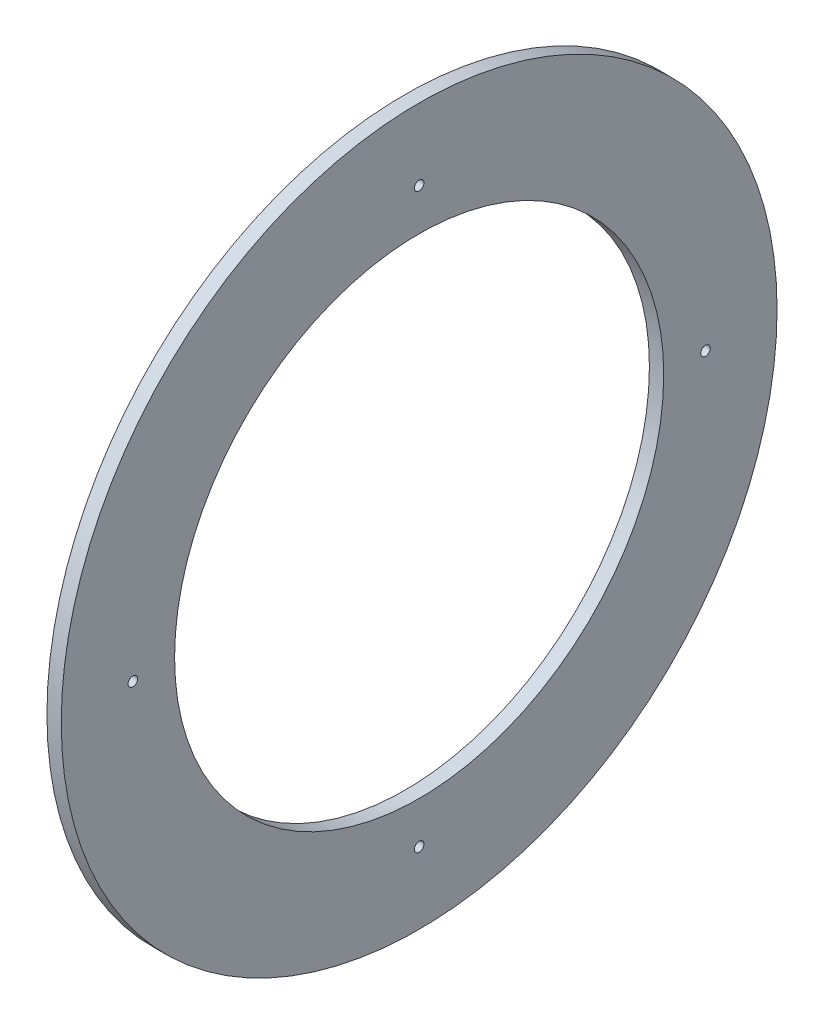
ISO-10303-21;
HEADER;
FILE_DESCRIPTION(('STEP AP214'),'2;1');
FILE_NAME('part.step','',(''),(''),'','','');
FILE_SCHEMA(('AUTOMOTIVE_DESIGN { 1 0 10303 214 1 1 1 1 }'));
ENDSEC;
DATA;
#1=APPLICATION_CONTEXT('core data for automotive mechanical design processes');
#2=APPLICATION_PROTOCOL_DEFINITION('international standard','automotive_design',2000,#1);
#3=PRODUCT_CONTEXT('',#1,'mechanical');
#4=PRODUCT('Part','Part','',(#3));
#5=PRODUCT_RELATED_PRODUCT_CATEGORY('part','',(#4));
#6=PRODUCT_DEFINITION_FORMATION('','',#4);
#7=PRODUCT_DEFINITION_CONTEXT('part definition',#1,'design');
#8=PRODUCT_DEFINITION('design','',#6,#7);
#9=PRODUCT_DEFINITION_SHAPE('','',#8);
#10=(LENGTH_UNIT() NAMED_UNIT(*) SI_UNIT(.MILLI.,.METRE.));
#11=(NAMED_UNIT(*) PLANE_ANGLE_UNIT() SI_UNIT($,.RADIAN.));
#12=(NAMED_UNIT(*) SI_UNIT($,.STERADIAN.) SOLID_ANGLE_UNIT());
#13=UNCERTAINTY_MEASURE_WITH_UNIT(LENGTH_MEASURE(1.E-05),#10,'distance_accuracy_value','');
#14=(GEOMETRIC_REPRESENTATION_CONTEXT(3) GLOBAL_UNCERTAINTY_ASSIGNED_CONTEXT((#13)) GLOBAL_UNIT_ASSIGNED_CONTEXT((#10,
#11,#12)) REPRESENTATION_CONTEXT('',''));
#15=CARTESIAN_POINT('',(0.,0.,0.));
#16=DIRECTION('',(0.,0.,1.));
#17=DIRECTION('',(1.,0.,0.));
#18=AXIS2_PLACEMENT_3D('',#15,#16,#17);
#19=CARTESIAN_POINT('',(3.,0.,0.));
#20=DIRECTION('',(1.,0.,0.));
#21=DIRECTION('',(0.,0.,-1.));
#22=AXIS2_PLACEMENT_3D('',#19,#20,#21);
#23=PLANE('',#22);
#24=CARTESIAN_POINT('',(3.,1.69795468502936E-12,-60.0000000000019));
#25=DIRECTION('',(1.,0.,0.));
#26=DIRECTION('',(0.,0.,-1.));
#27=AXIS2_PLACEMENT_3D('',#24,#25,#26);
#28=CIRCLE('',#27,0.999999999999998);
#29=CARTESIAN_POINT('',(3.,1.69795468502936E-12,-61.0000000000019));
#30=VERTEX_POINT('',#29);
#31=EDGE_CURVE('E68',#30,#30,#28,.T.);
#32=ORIENTED_EDGE('',*,*,#31,.F.);
#33=EDGE_LOOP('',(#32));
#34=FACE_BOUND('',#33,.T.);
#35=CARTESIAN_POINT('',(3.,-60.,-3.59206192068241E-12));
#36=DIRECTION('',(1.,0.,0.));
#37=DIRECTION('',(0.,0.,-1.));
#38=AXIS2_PLACEMENT_3D('',#35,#36,#37);
#39=CIRCLE('',#38,1.);
#40=CARTESIAN_POINT('',(3.,-60.,-1.00000000000359));
#41=VERTEX_POINT('',#40);
#42=EDGE_CURVE('E62',#41,#41,#39,.T.);
#43=ORIENTED_EDGE('',*,*,#42,.F.);
#44=EDGE_LOOP('',(#43));
#45=FACE_BOUND('',#44,.T.);
#46=CARTESIAN_POINT('',(3.,-1.70530256582424E-12,59.9999999999981));
#47=DIRECTION('',(1.,0.,0.));
#48=DIRECTION('',(0.,0.,-1.));
#49=AXIS2_PLACEMENT_3D('',#46,#47,#48);
#50=CIRCLE('',#49,0.999999999999998);
#51=CARTESIAN_POINT('',(3.,-1.70530256582424E-12,58.9999999999981));
#52=VERTEX_POINT('',#51);
#53=EDGE_CURVE('E56',#52,#52,#50,.T.);
#54=ORIENTED_EDGE('',*,*,#53,.F.);
#55=EDGE_LOOP('',(#54));
#56=FACE_BOUND('',#55,.T.);
#57=CARTESIAN_POINT('',(3.,60.,-1.96152550623697E-13));
#58=DIRECTION('',(1.,0.,0.));
#59=DIRECTION('',(0.,0.,-1.));
#60=AXIS2_PLACEMENT_3D('',#57,#58,#59);
#61=CIRCLE('',#60,1.);
#62=CARTESIAN_POINT('',(3.,60.,-1.0000000000002));
#63=VERTEX_POINT('',#62);
#64=EDGE_CURVE('E50',#63,#63,#61,.T.);
#65=ORIENTED_EDGE('',*,*,#64,.F.);
#66=EDGE_LOOP('',(#65));
#67=FACE_BOUND('',#66,.T.);
#68=CARTESIAN_POINT('',(3.,0.,0.));
#69=DIRECTION('',(1.,0.,0.));
#70=DIRECTION('',(0.,0.,-1.));
#71=AXIS2_PLACEMENT_3D('',#68,#69,#70);
#72=CIRCLE('',#71,75.);
#73=CARTESIAN_POINT('',(3.,0.,-75.));
#74=VERTEX_POINT('',#73);
#75=EDGE_CURVE('E10',#74,#74,#72,.T.);
#76=ORIENTED_EDGE('',*,*,#75,.T.);
#77=EDGE_LOOP('',(#76));
#78=FACE_BOUND('',#77,.T.);
#79=CARTESIAN_POINT('',(3.,0.,0.));
#80=DIRECTION('',(1.,0.,0.));
#81=DIRECTION('',(0.,0.,-1.));
#82=AXIS2_PLACEMENT_3D('',#79,#80,#81);
#83=CIRCLE('',#82,51.25);
#84=CARTESIAN_POINT('',(3.,0.,-51.25));
#85=VERTEX_POINT('',#84);
#86=EDGE_CURVE('E42',#85,#85,#83,.T.);
#87=ORIENTED_EDGE('',*,*,#86,.F.);
#88=EDGE_LOOP('',(#87));
#89=FACE_BOUND('',#88,.T.);
#90=ADVANCED_FACE('F31',(#34,#45,#56,#67,#78,#89),#23,.T.);
#91=CARTESIAN_POINT('',(0.,0.,0.));
#92=DIRECTION('',(1.,0.,0.));
#93=DIRECTION('',(0.,0.,-1.));
#94=AXIS2_PLACEMENT_3D('',#91,#92,#93);
#95=PLANE('',#94);
#96=CARTESIAN_POINT('',(0.,1.69795468502936E-12,-60.0000000000019));
#97=DIRECTION('',(1.,0.,0.));
#98=DIRECTION('',(0.,0.,-1.));
#99=AXIS2_PLACEMENT_3D('',#96,#97,#98);
#100=CIRCLE('',#99,0.999999999999998);
#101=CARTESIAN_POINT('',(0.,1.69795468502936E-12,-61.0000000000019));
#102=VERTEX_POINT('',#101);
#103=EDGE_CURVE('E53',#102,#102,#100,.T.);
#104=ORIENTED_EDGE('',*,*,#103,.T.);
#105=EDGE_LOOP('',(#104));
#106=FACE_BOUND('',#105,.T.);
#107=CARTESIAN_POINT('',(0.,-60.,-3.59206192068241E-12));
#108=DIRECTION('',(1.,0.,0.));
#109=DIRECTION('',(0.,0.,-1.));
#110=AXIS2_PLACEMENT_3D('',#107,#108,#109);
#111=CIRCLE('',#110,1.);
#112=CARTESIAN_POINT('',(0.,-60.,-1.00000000000359));
#113=VERTEX_POINT('',#112);
#114=EDGE_CURVE('E65',#113,#113,#111,.T.);
#115=ORIENTED_EDGE('',*,*,#114,.T.);
#116=EDGE_LOOP('',(#115));
#117=FACE_BOUND('',#116,.T.);
#118=CARTESIAN_POINT('',(0.,-1.70530256582424E-12,59.9999999999981));
#119=DIRECTION('',(1.,0.,0.));
#120=DIRECTION('',(0.,0.,-1.));
#121=AXIS2_PLACEMENT_3D('',#118,#119,#120);
#122=CIRCLE('',#121,0.999999999999998);
#123=CARTESIAN_POINT('',(0.,-1.70530256582424E-12,58.9999999999981));
#124=VERTEX_POINT('',#123);
#125=EDGE_CURVE('E59',#124,#124,#122,.T.);
#126=ORIENTED_EDGE('',*,*,#125,.T.);
#127=EDGE_LOOP('',(#126));
#128=FACE_BOUND('',#127,.T.);
#129=CARTESIAN_POINT('',(0.,60.,-1.96152550623697E-13));
#130=DIRECTION('',(1.,0.,0.));
#131=DIRECTION('',(0.,0.,-1.));
#132=AXIS2_PLACEMENT_3D('',#129,#130,#131);
#133=CIRCLE('',#132,1.);
#134=CARTESIAN_POINT('',(0.,60.,-1.0000000000002));
#135=VERTEX_POINT('',#134);
#136=EDGE_CURVE('E47',#135,#135,#133,.T.);
#137=ORIENTED_EDGE('',*,*,#136,.T.);
#138=EDGE_LOOP('',(#137));
#139=FACE_BOUND('',#138,.T.);
#140=CARTESIAN_POINT('',(0.,0.,0.));
#141=DIRECTION('',(1.,0.,0.));
#142=DIRECTION('',(0.,0.,-1.));
#143=AXIS2_PLACEMENT_3D('',#140,#141,#142);
#144=CIRCLE('',#143,75.);
#145=CARTESIAN_POINT('',(0.,0.,-75.));
#146=VERTEX_POINT('',#145);
#147=EDGE_CURVE('E35',#146,#146,#144,.T.);
#148=ORIENTED_EDGE('',*,*,#147,.F.);
#149=EDGE_LOOP('',(#148));
#150=FACE_BOUND('',#149,.T.);
#151=CARTESIAN_POINT('',(0.,0.,0.));
#152=DIRECTION('',(1.,0.,0.));
#153=DIRECTION('',(0.,0.,-1.));
#154=AXIS2_PLACEMENT_3D('',#151,#152,#153);
#155=CIRCLE('',#154,51.25);
#156=CARTESIAN_POINT('',(0.,0.,-51.25));
#157=VERTEX_POINT('',#156);
#158=EDGE_CURVE('E44',#157,#157,#155,.T.);
#159=ORIENTED_EDGE('',*,*,#158,.T.);
#160=EDGE_LOOP('',(#159));
#161=FACE_BOUND('',#160,.T.);
#162=ADVANCED_FACE('F74',(#106,#117,#128,#139,#150,#161),#95,.F.);
#163=CARTESIAN_POINT('',(3.,0.,0.));
#164=DIRECTION('',(-1.,0.,0.));
#165=DIRECTION('',(0.,0.,1.));
#166=AXIS2_PLACEMENT_3D('',#163,#164,#165);
#167=CYLINDRICAL_SURFACE('',#166,75.);
#168=ORIENTED_EDGE('',*,*,#75,.F.);
#169=EDGE_LOOP('',(#168));
#170=FACE_BOUND('',#169,.T.);
#171=ORIENTED_EDGE('',*,*,#147,.T.);
#172=EDGE_LOOP('',(#171));
#173=FACE_BOUND('',#172,.T.);
#174=ADVANCED_FACE('F33',(#170,#173),#167,.T.);
#175=CARTESIAN_POINT('',(3.,0.,0.));
#176=DIRECTION('',(-1.,0.,0.));
#177=DIRECTION('',(0.,0.,1.));
#178=AXIS2_PLACEMENT_3D('',#175,#176,#177);
#179=CYLINDRICAL_SURFACE('',#178,51.25);
#180=ORIENTED_EDGE('',*,*,#86,.T.);
#181=EDGE_LOOP('',(#180));
#182=FACE_BOUND('',#181,.T.);
#183=ORIENTED_EDGE('',*,*,#158,.F.);
#184=EDGE_LOOP('',(#183));
#185=FACE_BOUND('',#184,.T.);
#186=ADVANCED_FACE('F95',(#182,#185),#179,.F.);
#187=CARTESIAN_POINT('',(0.,60.,-1.96152550623697E-13));
#188=DIRECTION('',(1.,0.,0.));
#189=DIRECTION('',(0.,0.,-1.));
#190=AXIS2_PLACEMENT_3D('',#187,#188,#189);
#191=CYLINDRICAL_SURFACE('',#190,1.);
#192=ORIENTED_EDGE('',*,*,#136,.F.);
#193=EDGE_LOOP('',(#192));
#194=FACE_BOUND('',#193,.T.);
#195=ORIENTED_EDGE('',*,*,#64,.T.);
#196=EDGE_LOOP('',(#195));
#197=FACE_BOUND('',#196,.T.);
#198=ADVANCED_FACE('F98',(#194,#197),#191,.F.);
#199=CARTESIAN_POINT('',(0.,-1.70530256582424E-12,59.9999999999981));
#200=DIRECTION('',(1.,0.,0.));
#201=DIRECTION('',(0.,0.,-1.));
#202=AXIS2_PLACEMENT_3D('',#199,#200,#201);
#203=CYLINDRICAL_SURFACE('',#202,0.999999999999998);
#204=ORIENTED_EDGE('',*,*,#125,.F.);
#205=EDGE_LOOP('',(#204));
#206=FACE_BOUND('',#205,.T.);
#207=ORIENTED_EDGE('',*,*,#53,.T.);
#208=EDGE_LOOP('',(#207));
#209=FACE_BOUND('',#208,.T.);
#210=ADVANCED_FACE('F110',(#206,#209),#203,.F.);
#211=CARTESIAN_POINT('',(0.,-60.,-3.59206192068241E-12));
#212=DIRECTION('',(1.,0.,0.));
#213=DIRECTION('',(0.,0.,-1.));
#214=AXIS2_PLACEMENT_3D('',#211,#212,#213);
#215=CYLINDRICAL_SURFACE('',#214,1.);
#216=ORIENTED_EDGE('',*,*,#114,.F.);
#217=EDGE_LOOP('',(#216));
#218=FACE_BOUND('',#217,.T.);
#219=ORIENTED_EDGE('',*,*,#42,.T.);
#220=EDGE_LOOP('',(#219));
#221=FACE_BOUND('',#220,.T.);
#222=ADVANCED_FACE('F80',(#218,#221),#215,.F.);
#223=CARTESIAN_POINT('',(0.,1.69795468502936E-12,-60.0000000000019));
#224=DIRECTION('',(1.,0.,0.));
#225=DIRECTION('',(0.,0.,-1.));
#226=AXIS2_PLACEMENT_3D('',#223,#224,#225);
#227=CYLINDRICAL_SURFACE('',#226,0.999999999999998);
#228=ORIENTED_EDGE('',*,*,#103,.F.);
#229=EDGE_LOOP('',(#228));
#230=FACE_BOUND('',#229,.T.);
#231=ORIENTED_EDGE('',*,*,#31,.T.);
#232=EDGE_LOOP('',(#231));
#233=FACE_BOUND('',#232,.T.);
#234=ADVANCED_FACE('F77',(#230,#233),#227,.F.);
#235=CLOSED_SHELL('',(#90,#162,#174,#186,#198,#210,#222,#234));
#236=MANIFOLD_SOLID_BREP('B2',#235);
#237=ADVANCED_BREP_SHAPE_REPRESENTATION('',(#18,#236),#14);
#238=SHAPE_DEFINITION_REPRESENTATION(#9,#237);
ENDSEC;
END-ISO-10303-21;
